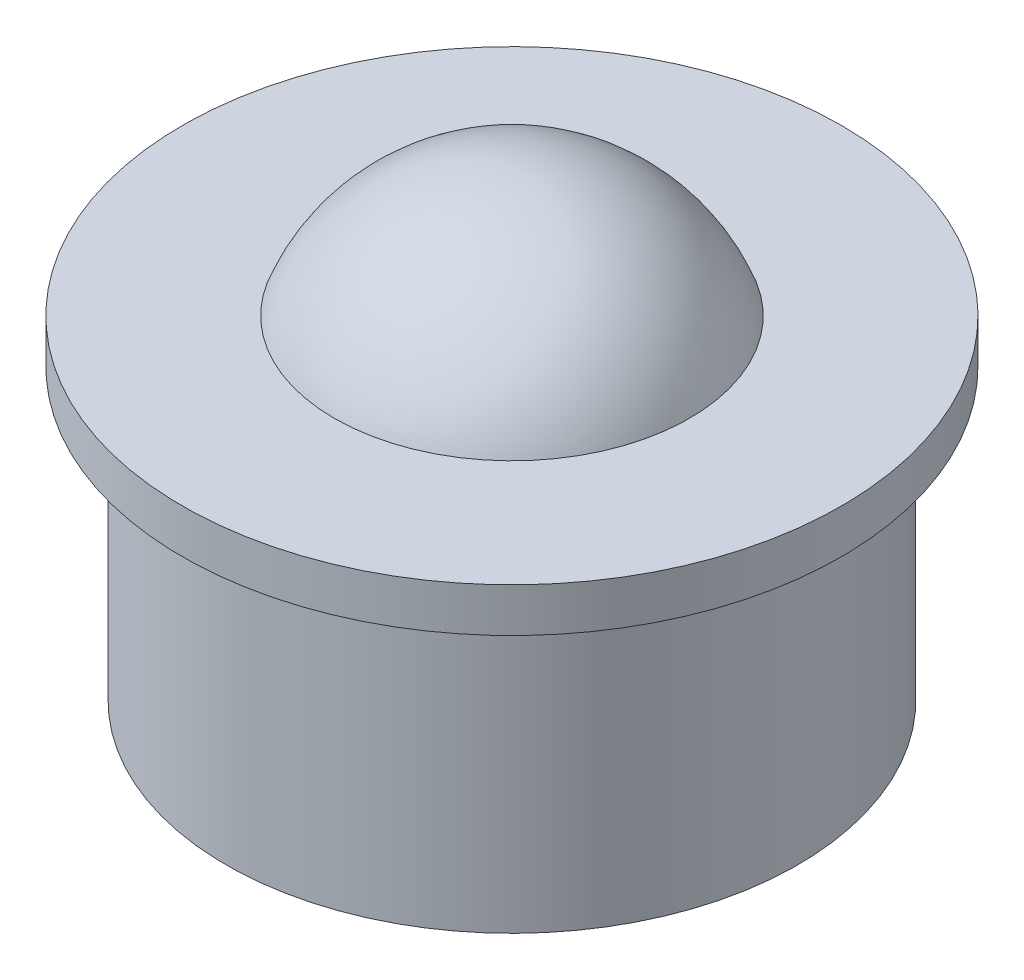
ISO-10303-21;
HEADER;
FILE_DESCRIPTION(('STEP AP214'),'2;1');
FILE_NAME('part.step','',(''),(''),'','','');
FILE_SCHEMA(('AUTOMOTIVE_DESIGN { 1 0 10303 214 1 1 1 1 }'));
ENDSEC;
DATA;
#1=APPLICATION_CONTEXT('core data for automotive mechanical design processes');
#2=APPLICATION_PROTOCOL_DEFINITION('international standard','automotive_design',2000,#1);
#3=PRODUCT_CONTEXT('',#1,'mechanical');
#4=PRODUCT('Part','Part','',(#3));
#5=PRODUCT_RELATED_PRODUCT_CATEGORY('part','',(#4));
#6=PRODUCT_DEFINITION_FORMATION('','',#4);
#7=PRODUCT_DEFINITION_CONTEXT('part definition',#1,'design');
#8=PRODUCT_DEFINITION('design','',#6,#7);
#9=PRODUCT_DEFINITION_SHAPE('','',#8);
#10=(LENGTH_UNIT() NAMED_UNIT(*) SI_UNIT(.MILLI.,.METRE.));
#11=(NAMED_UNIT(*) PLANE_ANGLE_UNIT() SI_UNIT($,.RADIAN.));
#12=(NAMED_UNIT(*) SI_UNIT($,.STERADIAN.) SOLID_ANGLE_UNIT());
#13=UNCERTAINTY_MEASURE_WITH_UNIT(LENGTH_MEASURE(1.E-05),#10,'distance_accuracy_value','');
#14=(GEOMETRIC_REPRESENTATION_CONTEXT(3) GLOBAL_UNCERTAINTY_ASSIGNED_CONTEXT((#13)) GLOBAL_UNIT_ASSIGNED_CONTEXT((#10,
#11,#12)) REPRESENTATION_CONTEXT('',''));
#15=CARTESIAN_POINT('',(0.,0.,0.));
#16=DIRECTION('',(0.,0.,1.));
#17=DIRECTION('',(1.,0.,0.));
#18=AXIS2_PLACEMENT_3D('',#15,#16,#17);
#19=CARTESIAN_POINT('',(0.,0.,0.));
#20=DIRECTION('',(0.,-1.,0.));
#21=DIRECTION('',(-1.,0.,0.));
#22=AXIS2_PLACEMENT_3D('',#19,#20,#21);
#23=SPHERICAL_SURFACE('',#22,4.32);
#24=CARTESIAN_POINT('',(0.,1.52,0.));
#25=DIRECTION('',(0.,1.,0.));
#26=DIRECTION('',(0.,0.,1.));
#27=AXIS2_PLACEMENT_3D('',#24,#25,#26);
#28=CIRCLE('',#27,4.04376062595204);
#29=CARTESIAN_POINT('',(0.,1.52,4.04376062595204));
#30=VERTEX_POINT('',#29);
#31=EDGE_CURVE('E10',#30,#30,#28,.F.);
#32=ORIENTED_EDGE('',*,*,#31,.F.);
#33=EDGE_LOOP('',(#32));
#34=FACE_BOUND('',#33,.T.);
#35=ADVANCED_FACE('F31',(#34),#23,.T.);
#36=CARTESIAN_POINT('',(0.,1.52,0.));
#37=DIRECTION('',(0.,1.,0.));
#38=DIRECTION('',(0.,0.,1.));
#39=AXIS2_PLACEMENT_3D('',#36,#37,#38);
#40=PLANE('',#39);
#41=ORIENTED_EDGE('',*,*,#31,.T.);
#42=EDGE_LOOP('',(#41));
#43=FACE_BOUND('',#42,.T.);
#44=CARTESIAN_POINT('',(0.,1.52,0.));
#45=DIRECTION('',(0.,-1.,0.));
#46=DIRECTION('',(0.,0.,-1.));
#47=AXIS2_PLACEMENT_3D('',#44,#45,#46);
#48=CIRCLE('',#47,7.5);
#49=CARTESIAN_POINT('',(0.,1.52,-7.5));
#50=VERTEX_POINT('',#49);
#51=EDGE_CURVE('E37',#50,#50,#48,.T.);
#52=ORIENTED_EDGE('',*,*,#51,.F.);
#53=EDGE_LOOP('',(#52));
#54=FACE_BOUND('',#53,.T.);
#55=ADVANCED_FACE('F70',(#43,#54),#40,.T.);
#56=CARTESIAN_POINT('',(0.,-6.05604586011882,0.));
#57=DIRECTION('',(0.,-1.,0.));
#58=DIRECTION('',(0.,0.,-1.));
#59=AXIS2_PLACEMENT_3D('',#56,#57,#58);
#60=CYLINDRICAL_SURFACE('',#59,7.5);
#61=ORIENTED_EDGE('',*,*,#51,.T.);
#62=EDGE_LOOP('',(#61));
#63=FACE_BOUND('',#62,.T.);
#64=CARTESIAN_POINT('',(0.,0.52,0.));
#65=DIRECTION('',(0.,-1.,0.));
#66=DIRECTION('',(0.,0.,-1.));
#67=AXIS2_PLACEMENT_3D('',#64,#65,#66);
#68=CIRCLE('',#67,7.5);
#69=CARTESIAN_POINT('',(0.,0.52,-7.5));
#70=VERTEX_POINT('',#69);
#71=EDGE_CURVE('E41',#70,#70,#68,.T.);
#72=ORIENTED_EDGE('',*,*,#71,.F.);
#73=EDGE_LOOP('',(#72));
#74=FACE_BOUND('',#73,.T.);
#75=ADVANCED_FACE('F66',(#63,#74),#60,.T.);
#76=CARTESIAN_POINT('',(7.5,0.52,0.));
#77=DIRECTION('',(0.,-1.,0.));
#78=DIRECTION('',(0.,0.,-1.));
#79=AXIS2_PLACEMENT_3D('',#76,#77,#78);
#80=PLANE('',#79);
#81=ORIENTED_EDGE('',*,*,#71,.T.);
#82=EDGE_LOOP('',(#81));
#83=FACE_BOUND('',#82,.T.);
#84=CARTESIAN_POINT('',(0.,0.52,0.));
#85=DIRECTION('',(0.,-1.,0.));
#86=DIRECTION('',(0.,0.,-1.));
#87=AXIS2_PLACEMENT_3D('',#84,#85,#86);
#88=CIRCLE('',#87,6.5);
#89=CARTESIAN_POINT('',(0.,0.52,-6.5));
#90=VERTEX_POINT('',#89);
#91=EDGE_CURVE('E45',#90,#90,#88,.T.);
#92=ORIENTED_EDGE('',*,*,#91,.F.);
#93=EDGE_LOOP('',(#92));
#94=FACE_BOUND('',#93,.T.);
#95=ADVANCED_FACE('F58',(#83,#94),#80,.T.);
#96=CARTESIAN_POINT('',(0.,-6.05604586011882,0.));
#97=DIRECTION('',(0.,-1.,0.));
#98=DIRECTION('',(0.,0.,-1.));
#99=AXIS2_PLACEMENT_3D('',#96,#97,#98);
#100=CYLINDRICAL_SURFACE('',#99,6.5);
#101=ORIENTED_EDGE('',*,*,#91,.T.);
#102=EDGE_LOOP('',(#101));
#103=FACE_BOUND('',#102,.T.);
#104=CARTESIAN_POINT('',(0.,-6.05604586011882,0.));
#105=DIRECTION('',(0.,-1.,0.));
#106=DIRECTION('',(0.,0.,-1.));
#107=AXIS2_PLACEMENT_3D('',#104,#105,#106);
#108=CIRCLE('',#107,6.5);
#109=CARTESIAN_POINT('',(0.,-6.05604586011882,-6.5));
#110=VERTEX_POINT('',#109);
#111=EDGE_CURVE('E50',#110,#110,#108,.T.);
#112=ORIENTED_EDGE('',*,*,#111,.F.);
#113=EDGE_LOOP('',(#112));
#114=FACE_BOUND('',#113,.T.);
#115=ADVANCED_FACE('F56',(#103,#114),#100,.T.);
#116=CARTESIAN_POINT('',(6.5,-6.05604586011882,0.));
#117=DIRECTION('',(0.,-1.,0.));
#118=DIRECTION('',(0.,0.,-1.));
#119=AXIS2_PLACEMENT_3D('',#116,#117,#118);
#120=PLANE('',#119);
#121=ORIENTED_EDGE('',*,*,#111,.T.);
#122=EDGE_LOOP('',(#121));
#123=FACE_BOUND('',#122,.T.);
#124=ADVANCED_FACE('F54',(#123),#120,.T.);
#125=CLOSED_SHELL('',(#35,#55,#75,#95,#115,#124));
#126=MANIFOLD_SOLID_BREP('B2',#125);
#127=ADVANCED_BREP_SHAPE_REPRESENTATION('',(#18,#126),#14);
#128=SHAPE_DEFINITION_REPRESENTATION(#9,#127);
ENDSEC;
END-ISO-10303-21;
